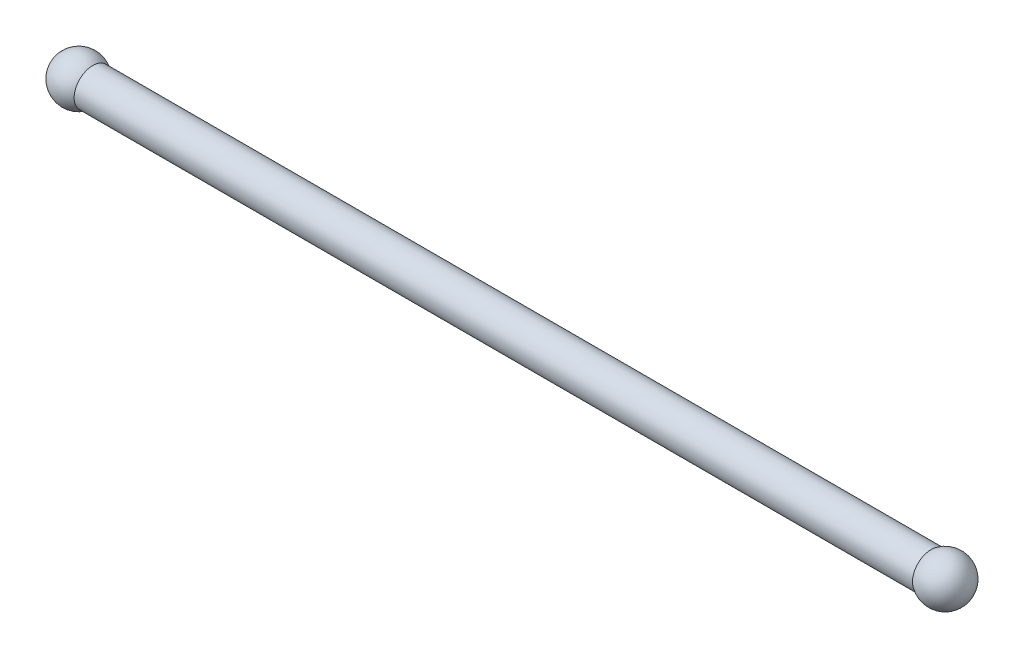
ISO-10303-21;
HEADER;
FILE_DESCRIPTION(('STEP AP214'),'2;1');
FILE_NAME('part.step','',(''),(''),'','','');
FILE_SCHEMA(('AUTOMOTIVE_DESIGN { 1 0 10303 214 1 1 1 1 }'));
ENDSEC;
DATA;
#1=APPLICATION_CONTEXT('core data for automotive mechanical design processes');
#2=APPLICATION_PROTOCOL_DEFINITION('international standard','automotive_design',2000,#1);
#3=PRODUCT_CONTEXT('',#1,'mechanical');
#4=PRODUCT('Part','Part','',(#3));
#5=PRODUCT_RELATED_PRODUCT_CATEGORY('part','',(#4));
#6=PRODUCT_DEFINITION_FORMATION('','',#4);
#7=PRODUCT_DEFINITION_CONTEXT('part definition',#1,'design');
#8=PRODUCT_DEFINITION('design','',#6,#7);
#9=PRODUCT_DEFINITION_SHAPE('','',#8);
#10=(LENGTH_UNIT() NAMED_UNIT(*) SI_UNIT(.MILLI.,.METRE.));
#11=(NAMED_UNIT(*) PLANE_ANGLE_UNIT() SI_UNIT($,.RADIAN.));
#12=(NAMED_UNIT(*) SI_UNIT($,.STERADIAN.) SOLID_ANGLE_UNIT());
#13=UNCERTAINTY_MEASURE_WITH_UNIT(LENGTH_MEASURE(1.E-05),#10,'distance_accuracy_value','');
#14=(GEOMETRIC_REPRESENTATION_CONTEXT(3) GLOBAL_UNCERTAINTY_ASSIGNED_CONTEXT((#13)) GLOBAL_UNIT_ASSIGNED_CONTEXT((#10,
#11,#12)) REPRESENTATION_CONTEXT('',''));
#15=CARTESIAN_POINT('',(0.,0.,0.));
#16=DIRECTION('',(0.,0.,1.));
#17=DIRECTION('',(1.,0.,0.));
#18=AXIS2_PLACEMENT_3D('',#15,#16,#17);
#19=CARTESIAN_POINT('',(45.,0.,0.));
#20=DIRECTION('',(-1.,0.,0.));
#21=DIRECTION('',(0.,0.,1.));
#22=AXIS2_PLACEMENT_3D('',#19,#20,#21);
#23=CYLINDRICAL_SURFACE('',#22,1.);
#24=CARTESIAN_POINT('',(45.,0.,0.));
#25=DIRECTION('',(1.,0.,0.));
#26=DIRECTION('',(0.,0.,-1.));
#27=AXIS2_PLACEMENT_3D('',#24,#25,#26);
#28=CIRCLE('',#27,1.);
#29=CARTESIAN_POINT('',(45.,0.,1.));
#30=VERTEX_POINT('',#29);
#31=EDGE_CURVE('E10',#30,#30,#28,.T.);
#32=CARTESIAN_POINT('',(0.,0.,0.));
#33=DIRECTION('',(1.,0.,0.));
#34=DIRECTION('',(0.,0.,-1.));
#35=AXIS2_PLACEMENT_3D('',#32,#33,#34);
#36=CIRCLE('',#35,1.);
#37=CARTESIAN_POINT('',(0.,0.,1.));
#38=VERTEX_POINT('',#37);
#39=EDGE_CURVE('E37',#38,#38,#36,.T.);
#40=CARTESIAN_POINT('',(45.,0.,1.));
#41=CARTESIAN_POINT('',(44.53125,0.,1.));
#42=CARTESIAN_POINT('',(44.0625,0.,1.));
#43=CARTESIAN_POINT('',(43.125,0.,1.));
#44=CARTESIAN_POINT('',(42.65625,0.,1.));
#45=CARTESIAN_POINT('',(41.71875,0.,1.));
#46=CARTESIAN_POINT('',(41.25,0.,1.));
#47=CARTESIAN_POINT('',(40.3125,0.,1.));
#48=CARTESIAN_POINT('',(39.84375,0.,1.));
#49=CARTESIAN_POINT('',(38.90625,0.,1.));
#50=CARTESIAN_POINT('',(38.4375,0.,1.));
#51=CARTESIAN_POINT('',(37.5,0.,1.));
#52=CARTESIAN_POINT('',(37.03125,0.,1.));
#53=CARTESIAN_POINT('',(36.09375,0.,1.));
#54=CARTESIAN_POINT('',(35.625,0.,1.));
#55=CARTESIAN_POINT('',(34.6875,0.,1.));
#56=CARTESIAN_POINT('',(34.21875,0.,1.));
#57=CARTESIAN_POINT('',(33.28125,0.,1.));
#58=CARTESIAN_POINT('',(32.8125,0.,1.));
#59=CARTESIAN_POINT('',(31.875,0.,1.));
#60=CARTESIAN_POINT('',(31.40625,0.,1.));
#61=CARTESIAN_POINT('',(30.46875,0.,1.));
#62=CARTESIAN_POINT('',(30.,0.,1.));
#63=CARTESIAN_POINT('',(29.0625,0.,1.));
#64=CARTESIAN_POINT('',(28.59375,0.,1.));
#65=CARTESIAN_POINT('',(27.65625,0.,1.));
#66=CARTESIAN_POINT('',(27.1875,0.,1.));
#67=CARTESIAN_POINT('',(26.25,0.,1.));
#68=CARTESIAN_POINT('',(25.78125,0.,1.));
#69=CARTESIAN_POINT('',(24.84375,0.,1.));
#70=CARTESIAN_POINT('',(24.375,0.,1.));
#71=CARTESIAN_POINT('',(23.4375,0.,1.));
#72=CARTESIAN_POINT('',(22.96875,0.,1.));
#73=CARTESIAN_POINT('',(22.03125,0.,1.));
#74=CARTESIAN_POINT('',(21.5625,0.,1.));
#75=CARTESIAN_POINT('',(20.625,0.,1.));
#76=CARTESIAN_POINT('',(20.15625,0.,1.));
#77=CARTESIAN_POINT('',(19.21875,0.,1.));
#78=CARTESIAN_POINT('',(18.75,0.,1.));
#79=CARTESIAN_POINT('',(17.8125,0.,1.));
#80=CARTESIAN_POINT('',(17.34375,0.,1.));
#81=CARTESIAN_POINT('',(16.40625,0.,1.));
#82=CARTESIAN_POINT('',(15.9375,0.,1.));
#83=CARTESIAN_POINT('',(15.,0.,1.));
#84=CARTESIAN_POINT('',(14.53125,0.,1.));
#85=CARTESIAN_POINT('',(13.59375,0.,1.));
#86=CARTESIAN_POINT('',(13.125,0.,1.));
#87=CARTESIAN_POINT('',(12.1875,0.,1.));
#88=CARTESIAN_POINT('',(11.71875,0.,1.));
#89=CARTESIAN_POINT('',(10.78125,0.,1.));
#90=CARTESIAN_POINT('',(10.3125,0.,1.));
#91=CARTESIAN_POINT('',(9.37499999999999,0.,1.));
#92=CARTESIAN_POINT('',(8.90624999999999,0.,1.));
#93=CARTESIAN_POINT('',(7.96874999999999,0.,1.));
#94=CARTESIAN_POINT('',(7.5,0.,1.));
#95=CARTESIAN_POINT('',(6.56249999999999,0.,1.));
#96=CARTESIAN_POINT('',(6.09374999999999,0.,1.));
#97=CARTESIAN_POINT('',(5.15624999999999,0.,1.));
#98=CARTESIAN_POINT('',(4.68749999999999,0.,1.));
#99=CARTESIAN_POINT('',(3.74999999999999,0.,1.));
#100=CARTESIAN_POINT('',(3.28124999999999,0.,1.));
#101=CARTESIAN_POINT('',(2.34374999999999,0.,1.));
#102=CARTESIAN_POINT('',(1.87499999999999,0.,1.));
#103=CARTESIAN_POINT('',(0.937499999999992,0.,1.));
#104=CARTESIAN_POINT('',(0.468749999999993,0.,1.));
#105=CARTESIAN_POINT('',(0.,0.,1.));
#106=B_SPLINE_CURVE_WITH_KNOTS('',3,(#40,#41,#42,#43,#44,#45,#46,#47,#48,#49,#50,#51,#52,#53,
#54,#55,#56,#57,#58,#59,#60,#61,#62,#63,#64,#65,#66,#67,#68,#69,#70,#71,#72,#73,#74,#75,#76,#77,
#78,#79,#80,#81,#82,#83,#84,#85,#86,#87,#88,#89,#90,#91,#92,#93,#94,#95,#96,#97,#98,#99,#100,
#101,#102,#103,#104,#105),.UNSPECIFIED.,.F.,.F.,(4,2,2,2,2,2,2,2,2,2,2,2,2,2,2,2,2,2,2,2,2,2,2,
2,2,2,2,2,2,2,2,2,4),(0.,1.40625,2.8125,4.21874999999999,5.625,7.03125,8.43749999999999,9.84375,
11.25,12.65625,14.0625,15.46875,16.875,18.28125,19.6875,21.09375,22.5,23.90625,25.3125,26.71875,
28.125,29.53125,30.9375,32.34375,33.75,35.15625,36.5625,37.96875,39.375,40.78125,42.1875,
43.59375,45.),.UNSPECIFIED.);
#107=EDGE_CURVE('BSEAM30',#30,#38,#106,.T.);
#108=ORIENTED_EDGE('',*,*,#31,.F.);
#109=ORIENTED_EDGE('',*,*,#39,.T.);
#110=ORIENTED_EDGE('',*,*,#107,.T.);
#111=ORIENTED_EDGE('',*,*,#107,.F.);
#112=EDGE_LOOP('',(#108,#110,#109,#111));
#113=FACE_BOUND('',#112,.T.);
#114=ADVANCED_FACE('F30',(#113),#23,.T.);
#115=CARTESIAN_POINT('',(45.75,0.,0.));
#116=DIRECTION('',(0.,0.,1.));
#117=DIRECTION('',(1.,0.,0.));
#118=AXIS2_PLACEMENT_3D('',#115,#116,#117);
#119=SPHERICAL_SURFACE('',#118,1.25);
#120=CARTESIAN_POINT('',(45.75,0.,0.));
#121=DIRECTION('',(1.,0.,0.));
#122=DIRECTION('',(0.,0.,-1.));
#123=AXIS2_PLACEMENT_3D('',#120,#121,#122);
#124=SPHERICAL_SURFACE('',#123,1.25);
#125=ORIENTED_EDGE('',*,*,#31,.T.);
#126=EDGE_LOOP('',(#125));
#127=FACE_BOUND('',#126,.T.);
#128=ADVANCED_FACE('F32',(#127),#124,.T.);
#129=CARTESIAN_POINT('',(-0.75,0.,0.));
#130=DIRECTION('',(0.,0.,1.));
#131=DIRECTION('',(1.,0.,0.));
#132=AXIS2_PLACEMENT_3D('',#129,#130,#131);
#133=SPHERICAL_SURFACE('',#132,1.25);
#134=CARTESIAN_POINT('',(-0.75,0.,0.));
#135=DIRECTION('',(1.,0.,0.));
#136=DIRECTION('',(0.,0.,-1.));
#137=AXIS2_PLACEMENT_3D('',#134,#135,#136);
#138=SPHERICAL_SURFACE('',#137,1.25);
#139=ORIENTED_EDGE('',*,*,#39,.F.);
#140=EDGE_LOOP('',(#139));
#141=FACE_BOUND('',#140,.T.);
#142=ADVANCED_FACE('F44',(#141),#138,.T.);
#143=CLOSED_SHELL('',(#114,#128,#142));
#144=MANIFOLD_SOLID_BREP('B2',#143);
#145=ADVANCED_BREP_SHAPE_REPRESENTATION('',(#18,#144),#14);
#146=SHAPE_DEFINITION_REPRESENTATION(#9,#145);
ENDSEC;
END-ISO-10303-21;
